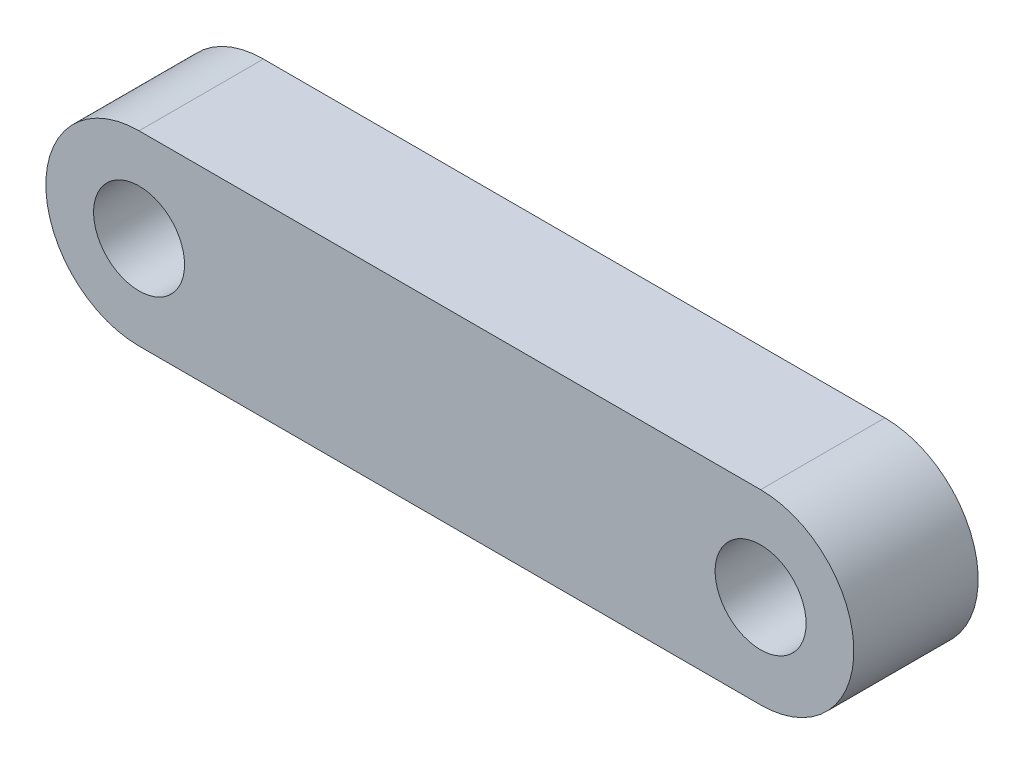
ISO-10303-21;
HEADER;
FILE_DESCRIPTION(('STEP AP214'),'2;1');
FILE_NAME('part.step','',(''),(''),'','','');
FILE_SCHEMA(('AUTOMOTIVE_DESIGN { 1 0 10303 214 1 1 1 1 }'));
ENDSEC;
DATA;
#1=APPLICATION_CONTEXT('core data for automotive mechanical design processes');
#2=APPLICATION_PROTOCOL_DEFINITION('international standard','automotive_design',2000,#1);
#3=PRODUCT_CONTEXT('',#1,'mechanical');
#4=PRODUCT('Part','Part','',(#3));
#5=PRODUCT_RELATED_PRODUCT_CATEGORY('part','',(#4));
#6=PRODUCT_DEFINITION_FORMATION('','',#4);
#7=PRODUCT_DEFINITION_CONTEXT('part definition',#1,'design');
#8=PRODUCT_DEFINITION('design','',#6,#7);
#9=PRODUCT_DEFINITION_SHAPE('','',#8);
#10=(LENGTH_UNIT() NAMED_UNIT(*) SI_UNIT(.MILLI.,.METRE.));
#11=(NAMED_UNIT(*) PLANE_ANGLE_UNIT() SI_UNIT($,.RADIAN.));
#12=(NAMED_UNIT(*) SI_UNIT($,.STERADIAN.) SOLID_ANGLE_UNIT());
#13=UNCERTAINTY_MEASURE_WITH_UNIT(LENGTH_MEASURE(1.E-05),#10,'distance_accuracy_value','');
#14=(GEOMETRIC_REPRESENTATION_CONTEXT(3) GLOBAL_UNCERTAINTY_ASSIGNED_CONTEXT((#13)) GLOBAL_UNIT_ASSIGNED_CONTEXT((#10,
#11,#12)) REPRESENTATION_CONTEXT('',''));
#15=CARTESIAN_POINT('',(0.,0.,0.));
#16=DIRECTION('',(0.,0.,1.));
#17=DIRECTION('',(1.,0.,0.));
#18=AXIS2_PLACEMENT_3D('',#15,#16,#17);
#19=CARTESIAN_POINT('',(0.,0.,10.));
#20=DIRECTION('',(0.,0.,1.));
#21=DIRECTION('',(1.,0.,0.));
#22=AXIS2_PLACEMENT_3D('',#19,#20,#21);
#23=PLANE('',#22);
#24=CARTESIAN_POINT('',(0.,0.,10.));
#25=DIRECTION('',(0.,0.,1.));
#26=DIRECTION('',(1.,0.,0.));
#27=AXIS2_PLACEMENT_3D('',#24,#25,#26);
#28=CIRCLE('',#27,3.6576);
#29=CARTESIAN_POINT('',(3.6576,0.,10.));
#30=VERTEX_POINT('',#29);
#31=EDGE_CURVE('E112',#30,#30,#28,.T.);
#32=ORIENTED_EDGE('',*,*,#31,.F.);
#33=EDGE_LOOP('',(#32));
#34=FACE_BOUND('',#33,.T.);
#35=CARTESIAN_POINT('',(0.,0.,10.));
#36=DIRECTION('',(0.,0.,1.));
#37=DIRECTION('',(1.,0.,0.));
#38=AXIS2_PLACEMENT_3D('',#35,#36,#37);
#39=CIRCLE('',#38,7.5);
#40=CARTESIAN_POINT('',(0.,7.5,10.));
#41=VERTEX_POINT('',#40);
#42=CARTESIAN_POINT('',(0.,-7.5,10.));
#43=VERTEX_POINT('',#42);
#44=EDGE_CURVE('E92',#41,#43,#39,.T.);
#45=ORIENTED_EDGE('',*,*,#44,.T.);
#46=DIRECTION('',(1.,0.,0.));
#47=VECTOR('',#46,1.);
#48=CARTESIAN_POINT('',(0.,-7.5,10.));
#49=LINE('',#48,#47);
#50=CARTESIAN_POINT('',(50.,-7.5,10.));
#51=VERTEX_POINT('',#50);
#52=EDGE_CURVE('E87',#43,#51,#49,.T.);
#53=ORIENTED_EDGE('',*,*,#52,.T.);
#54=CARTESIAN_POINT('',(50.,0.,10.));
#55=DIRECTION('',(0.,0.,1.));
#56=DIRECTION('',(1.,0.,0.));
#57=AXIS2_PLACEMENT_3D('',#54,#55,#56);
#58=CIRCLE('',#57,7.5);
#59=CARTESIAN_POINT('',(50.,7.5,10.));
#60=VERTEX_POINT('',#59);
#61=EDGE_CURVE('E90',#51,#60,#58,.T.);
#62=ORIENTED_EDGE('',*,*,#61,.T.);
#63=DIRECTION('',(-1.,0.,0.));
#64=VECTOR('',#63,1.);
#65=CARTESIAN_POINT('',(0.,7.5,10.));
#66=LINE('',#65,#64);
#67=EDGE_CURVE('E57',#60,#41,#66,.T.);
#68=ORIENTED_EDGE('',*,*,#67,.T.);
#69=EDGE_LOOP('',(#45,#53,#62,#68));
#70=FACE_BOUND('',#69,.T.);
#71=CARTESIAN_POINT('',(50.,0.,10.));
#72=DIRECTION('',(0.,0.,1.));
#73=DIRECTION('',(1.,0.,0.));
#74=AXIS2_PLACEMENT_3D('',#71,#72,#73);
#75=CIRCLE('',#74,3.6576);
#76=CARTESIAN_POINT('',(53.6576,0.,10.));
#77=VERTEX_POINT('',#76);
#78=EDGE_CURVE('E134',#77,#77,#75,.T.);
#79=ORIENTED_EDGE('',*,*,#78,.F.);
#80=EDGE_LOOP('',(#79));
#81=FACE_BOUND('',#80,.T.);
#82=ADVANCED_FACE('F39',(#34,#70,#81),#23,.T.);
#83=CARTESIAN_POINT('',(0.,0.,0.));
#84=DIRECTION('',(0.,0.,1.));
#85=DIRECTION('',(1.,0.,0.));
#86=AXIS2_PLACEMENT_3D('',#83,#84,#85);
#87=PLANE('',#86);
#88=CARTESIAN_POINT('',(0.,0.,0.));
#89=DIRECTION('',(0.,0.,1.));
#90=DIRECTION('',(1.,0.,0.));
#91=AXIS2_PLACEMENT_3D('',#88,#89,#90);
#92=CIRCLE('',#91,7.5);
#93=CARTESIAN_POINT('',(0.,7.5,0.));
#94=VERTEX_POINT('',#93);
#95=CARTESIAN_POINT('',(0.,-7.5,0.));
#96=VERTEX_POINT('',#95);
#97=EDGE_CURVE('E108',#94,#96,#92,.T.);
#98=ORIENTED_EDGE('',*,*,#97,.F.);
#99=DIRECTION('',(-1.,0.,0.));
#100=VECTOR('',#99,1.);
#101=CARTESIAN_POINT('',(0.,7.5,0.));
#102=LINE('',#101,#100);
#103=CARTESIAN_POINT('',(50.,7.5,0.));
#104=VERTEX_POINT('',#103);
#105=EDGE_CURVE('E80',#104,#94,#102,.T.);
#106=ORIENTED_EDGE('',*,*,#105,.F.);
#107=CARTESIAN_POINT('',(50.,0.,0.));
#108=DIRECTION('',(0.,0.,1.));
#109=DIRECTION('',(1.,0.,0.));
#110=AXIS2_PLACEMENT_3D('',#107,#108,#109);
#111=CIRCLE('',#110,7.5);
#112=CARTESIAN_POINT('',(50.,-7.5,0.));
#113=VERTEX_POINT('',#112);
#114=EDGE_CURVE('E74',#113,#104,#111,.T.);
#115=ORIENTED_EDGE('',*,*,#114,.F.);
#116=DIRECTION('',(1.,0.,0.));
#117=VECTOR('',#116,1.);
#118=CARTESIAN_POINT('',(0.,-7.5,0.));
#119=LINE('',#118,#117);
#120=EDGE_CURVE('E97',#96,#113,#119,.T.);
#121=ORIENTED_EDGE('',*,*,#120,.F.);
#122=EDGE_LOOP('',(#98,#106,#115,#121));
#123=FACE_BOUND('',#122,.T.);
#124=CARTESIAN_POINT('',(0.,0.,0.));
#125=DIRECTION('',(0.,0.,1.));
#126=DIRECTION('',(1.,0.,0.));
#127=AXIS2_PLACEMENT_3D('',#124,#125,#126);
#128=CIRCLE('',#127,3.6576);
#129=CARTESIAN_POINT('',(3.6576,0.,0.));
#130=VERTEX_POINT('',#129);
#131=EDGE_CURVE('E130',#130,#130,#128,.T.);
#132=ORIENTED_EDGE('',*,*,#131,.T.);
#133=EDGE_LOOP('',(#132));
#134=FACE_BOUND('',#133,.T.);
#135=CARTESIAN_POINT('',(50.,0.,0.));
#136=DIRECTION('',(0.,0.,1.));
#137=DIRECTION('',(1.,0.,0.));
#138=AXIS2_PLACEMENT_3D('',#135,#136,#137);
#139=CIRCLE('',#138,3.6576);
#140=CARTESIAN_POINT('',(53.6576,0.,0.));
#141=VERTEX_POINT('',#140);
#142=EDGE_CURVE('E138',#141,#141,#139,.T.);
#143=ORIENTED_EDGE('',*,*,#142,.T.);
#144=EDGE_LOOP('',(#143));
#145=FACE_BOUND('',#144,.T.);
#146=ADVANCED_FACE('F125',(#123,#134,#145),#87,.F.);
#147=CARTESIAN_POINT('',(0.,0.,10.));
#148=DIRECTION('',(0.,0.,-1.));
#149=DIRECTION('',(-1.,0.,0.));
#150=AXIS2_PLACEMENT_3D('',#147,#148,#149);
#151=CYLINDRICAL_SURFACE('',#150,7.5);
#152=ORIENTED_EDGE('',*,*,#97,.T.);
#153=DIRECTION('',(0.,0.,-1.));
#154=VECTOR('',#153,1.);
#155=CARTESIAN_POINT('',(0.,-7.5,10.));
#156=LINE('',#155,#154);
#157=EDGE_CURVE('E11',#43,#96,#156,.T.);
#158=ORIENTED_EDGE('',*,*,#157,.F.);
#159=ORIENTED_EDGE('',*,*,#44,.F.);
#160=DIRECTION('',(0.,0.,-1.));
#161=VECTOR('',#160,1.);
#162=CARTESIAN_POINT('',(0.,7.5,10.));
#163=LINE('',#162,#161);
#164=EDGE_CURVE('E104',#41,#94,#163,.T.);
#165=ORIENTED_EDGE('',*,*,#164,.T.);
#166=EDGE_LOOP('',(#152,#158,#159,#165));
#167=FACE_BOUND('',#166,.T.);
#168=ADVANCED_FACE('F41',(#167),#151,.T.);
#169=CARTESIAN_POINT('',(0.,-7.5,10.));
#170=DIRECTION('',(0.,1.,0.));
#171=DIRECTION('',(0.,0.,1.));
#172=AXIS2_PLACEMENT_3D('',#169,#170,#171);
#173=PLANE('',#172);
#174=ORIENTED_EDGE('',*,*,#120,.T.);
#175=DIRECTION('',(0.,0.,-1.));
#176=VECTOR('',#175,1.);
#177=CARTESIAN_POINT('',(50.,-7.5,10.));
#178=LINE('',#177,#176);
#179=EDGE_CURVE('E49',#51,#113,#178,.T.);
#180=ORIENTED_EDGE('',*,*,#179,.F.);
#181=ORIENTED_EDGE('',*,*,#52,.F.);
#182=ORIENTED_EDGE('',*,*,#157,.T.);
#183=EDGE_LOOP('',(#174,#180,#181,#182));
#184=FACE_BOUND('',#183,.T.);
#185=ADVANCED_FACE('F96',(#184),#173,.F.);
#186=CARTESIAN_POINT('',(50.,0.,10.));
#187=DIRECTION('',(0.,0.,-1.));
#188=DIRECTION('',(-1.,0.,0.));
#189=AXIS2_PLACEMENT_3D('',#186,#187,#188);
#190=CYLINDRICAL_SURFACE('',#189,7.5);
#191=ORIENTED_EDGE('',*,*,#114,.T.);
#192=DIRECTION('',(0.,0.,-1.));
#193=VECTOR('',#192,1.);
#194=CARTESIAN_POINT('',(50.,7.5,10.));
#195=LINE('',#194,#193);
#196=EDGE_CURVE('E99',#60,#104,#195,.T.);
#197=ORIENTED_EDGE('',*,*,#196,.F.);
#198=ORIENTED_EDGE('',*,*,#61,.F.);
#199=ORIENTED_EDGE('',*,*,#179,.T.);
#200=EDGE_LOOP('',(#191,#197,#198,#199));
#201=FACE_BOUND('',#200,.T.);
#202=ADVANCED_FACE('F100',(#201),#190,.T.);
#203=CARTESIAN_POINT('',(0.,7.5,10.));
#204=DIRECTION('',(0.,-1.,0.));
#205=DIRECTION('',(0.,0.,-1.));
#206=AXIS2_PLACEMENT_3D('',#203,#204,#205);
#207=PLANE('',#206);
#208=ORIENTED_EDGE('',*,*,#105,.T.);
#209=ORIENTED_EDGE('',*,*,#164,.F.);
#210=ORIENTED_EDGE('',*,*,#67,.F.);
#211=ORIENTED_EDGE('',*,*,#196,.T.);
#212=EDGE_LOOP('',(#208,#209,#210,#211));
#213=FACE_BOUND('',#212,.T.);
#214=ADVANCED_FACE('F122',(#213),#207,.F.);
#215=CARTESIAN_POINT('',(0.,0.,10.));
#216=DIRECTION('',(0.,0.,-1.));
#217=DIRECTION('',(-1.,0.,0.));
#218=AXIS2_PLACEMENT_3D('',#215,#216,#217);
#219=CYLINDRICAL_SURFACE('',#218,3.6576);
#220=ORIENTED_EDGE('',*,*,#31,.T.);
#221=EDGE_LOOP('',(#220));
#222=FACE_BOUND('',#221,.T.);
#223=ORIENTED_EDGE('',*,*,#131,.F.);
#224=EDGE_LOOP('',(#223));
#225=FACE_BOUND('',#224,.T.);
#226=ADVANCED_FACE('F157',(#222,#225),#219,.F.);
#227=CARTESIAN_POINT('',(50.,0.,10.));
#228=DIRECTION('',(0.,0.,-1.));
#229=DIRECTION('',(-1.,0.,0.));
#230=AXIS2_PLACEMENT_3D('',#227,#228,#229);
#231=CYLINDRICAL_SURFACE('',#230,3.6576);
#232=ORIENTED_EDGE('',*,*,#78,.T.);
#233=EDGE_LOOP('',(#232));
#234=FACE_BOUND('',#233,.T.);
#235=ORIENTED_EDGE('',*,*,#142,.F.);
#236=EDGE_LOOP('',(#235));
#237=FACE_BOUND('',#236,.T.);
#238=ADVANCED_FACE('F146',(#234,#237),#231,.F.);
#239=CLOSED_SHELL('',(#82,#146,#168,#185,#202,#214,#226,#238));
#240=MANIFOLD_SOLID_BREP('B2',#239);
#241=ADVANCED_BREP_SHAPE_REPRESENTATION('',(#18,#240),#14);
#242=SHAPE_DEFINITION_REPRESENTATION(#9,#241);
ENDSEC;
END-ISO-10303-21;
